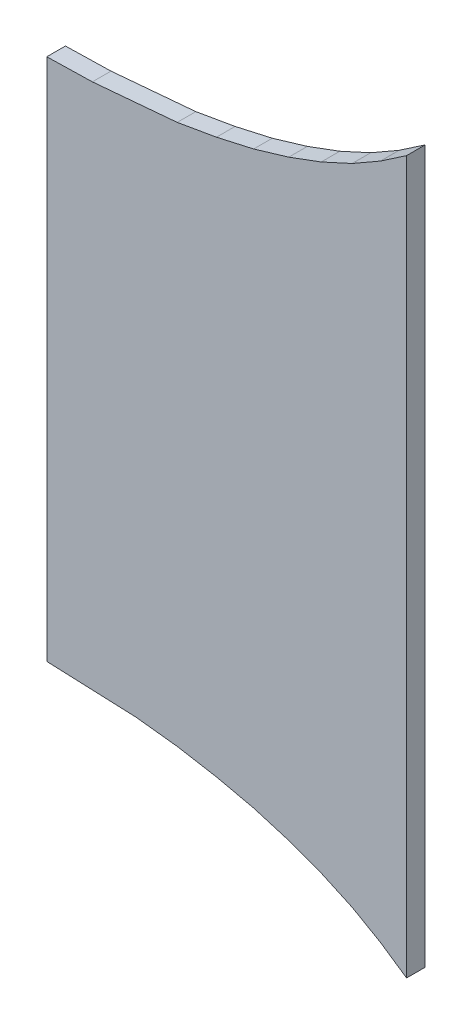
ISO-10303-21;
HEADER;
FILE_DESCRIPTION(('STEP AP214'),'2;1');
FILE_NAME('part.step','',(''),(''),'','','');
FILE_SCHEMA(('AUTOMOTIVE_DESIGN { 1 0 10303 214 1 1 1 1 }'));
ENDSEC;
DATA;
#1=APPLICATION_CONTEXT('core data for automotive mechanical design processes');
#2=APPLICATION_PROTOCOL_DEFINITION('international standard','automotive_design',2000,#1);
#3=PRODUCT_CONTEXT('',#1,'mechanical');
#4=PRODUCT('Part','Part','',(#3));
#5=PRODUCT_RELATED_PRODUCT_CATEGORY('part','',(#4));
#6=PRODUCT_DEFINITION_FORMATION('','',#4);
#7=PRODUCT_DEFINITION_CONTEXT('part definition',#1,'design');
#8=PRODUCT_DEFINITION('design','',#6,#7);
#9=PRODUCT_DEFINITION_SHAPE('','',#8);
#10=(LENGTH_UNIT() NAMED_UNIT(*) SI_UNIT(.MILLI.,.METRE.));
#11=(NAMED_UNIT(*) PLANE_ANGLE_UNIT() SI_UNIT($,.RADIAN.));
#12=(NAMED_UNIT(*) SI_UNIT($,.STERADIAN.) SOLID_ANGLE_UNIT());
#13=UNCERTAINTY_MEASURE_WITH_UNIT(LENGTH_MEASURE(1.E-05),#10,'distance_accuracy_value','');
#14=(GEOMETRIC_REPRESENTATION_CONTEXT(3) GLOBAL_UNCERTAINTY_ASSIGNED_CONTEXT((#13)) GLOBAL_UNIT_ASSIGNED_CONTEXT((#10,
#11,#12)) REPRESENTATION_CONTEXT('',''));
#15=CARTESIAN_POINT('',(0.,0.,0.));
#16=DIRECTION('',(0.,0.,1.));
#17=DIRECTION('',(1.,0.,0.));
#18=AXIS2_PLACEMENT_3D('',#15,#16,#17);
#19=CARTESIAN_POINT('',(78.7030029296875,79.6600036621094,0.));
#20=DIRECTION('',(0.0411642535086631,0.999152392897637,0.));
#21=DIRECTION('',(0.999152392897637,-0.0411642535086631,0.));
#22=AXIS2_PLACEMENT_3D('',#19,#20,#21);
#23=PLANE('',#22);
#24=DIRECTION('',(0.999152392897637,-0.0411642535086631,0.));
#25=VECTOR('',#24,1.);
#26=CARTESIAN_POINT('',(78.7030029296875,79.6600036621094,0.03556));
#27=LINE('',#26,#25);
#28=CARTESIAN_POINT('',(78.7030029296875,79.6600036621094,0.03556));
#29=VERTEX_POINT('',#28);
#30=CARTESIAN_POINT('',(78.8730010986328,79.6529998779297,0.03556));
#31=VERTEX_POINT('',#30);
#32=EDGE_CURVE('E11',#29,#31,#27,.T.);
#33=ORIENTED_EDGE('',*,*,#32,.F.);
#34=DIRECTION('',(0.,0.,1.));
#35=VECTOR('',#34,1.);
#36=CARTESIAN_POINT('',(78.7030029296875,79.6600036621094,0.));
#37=LINE('',#36,#35);
#38=CARTESIAN_POINT('',(78.7030029296875,79.6600036621094,0.));
#39=VERTEX_POINT('',#38);
#40=EDGE_CURVE('E24',#39,#29,#37,.T.);
#41=ORIENTED_EDGE('',*,*,#40,.F.);
#42=DIRECTION('',(0.999152392897637,-0.0411642535086631,0.));
#43=VECTOR('',#42,1.);
#44=CARTESIAN_POINT('',(78.7030029296875,79.6600036621094,0.));
#45=LINE('',#44,#43);
#46=CARTESIAN_POINT('',(78.8730010986328,79.6529998779297,0.));
#47=VERTEX_POINT('',#46);
#48=EDGE_CURVE('E172',#39,#47,#45,.T.);
#49=ORIENTED_EDGE('',*,*,#48,.T.);
#50=DIRECTION('',(0.,0.,1.));
#51=VECTOR('',#50,1.);
#52=CARTESIAN_POINT('',(78.8730010986328,79.6529998779297,0.));
#53=LINE('',#52,#51);
#54=EDGE_CURVE('E37',#47,#31,#53,.T.);
#55=ORIENTED_EDGE('',*,*,#54,.T.);
#56=EDGE_LOOP('',(#33,#41,#49,#55));
#57=FACE_BOUND('',#56,.T.);
#58=ADVANCED_FACE('F17',(#57),#23,.F.);
#59=CARTESIAN_POINT('',(78.8730010986328,79.6529998779297,0.));
#60=DIRECTION('',(0.113221852593987,0.993569731873504,0.));
#61=DIRECTION('',(0.993569731873504,-0.113221852593987,0.));
#62=AXIS2_PLACEMENT_3D('',#59,#60,#61);
#63=PLANE('',#62);
#64=DIRECTION('',(0.993569731873504,-0.113221852593987,0.));
#65=VECTOR('',#64,1.);
#66=CARTESIAN_POINT('',(78.8730010986328,79.6529998779297,0.03556));
#67=LINE('',#66,#65);
#68=CARTESIAN_POINT('',(78.9520034790039,79.6439971923828,0.03556));
#69=VERTEX_POINT('',#68);
#70=EDGE_CURVE('E308',#31,#69,#67,.T.);
#71=ORIENTED_EDGE('',*,*,#70,.F.);
#72=ORIENTED_EDGE('',*,*,#54,.F.);
#73=DIRECTION('',(0.993569731873504,-0.113221852593987,0.));
#74=VECTOR('',#73,1.);
#75=CARTESIAN_POINT('',(78.8730010986328,79.6529998779297,0.));
#76=LINE('',#75,#74);
#77=CARTESIAN_POINT('',(78.9520034790039,79.6439971923828,0.));
#78=VERTEX_POINT('',#77);
#79=EDGE_CURVE('E305',#47,#78,#76,.T.);
#80=ORIENTED_EDGE('',*,*,#79,.T.);
#81=DIRECTION('',(0.,0.,1.));
#82=VECTOR('',#81,1.);
#83=CARTESIAN_POINT('',(78.9520034790039,79.6439971923828,0.));
#84=LINE('',#83,#82);
#85=EDGE_CURVE('E303',#78,#69,#84,.T.);
#86=ORIENTED_EDGE('',*,*,#85,.T.);
#87=EDGE_LOOP('',(#71,#72,#80,#86));
#88=FACE_BOUND('',#87,.T.);
#89=ADVANCED_FACE('F316',(#88),#63,.F.);
#90=CARTESIAN_POINT('',(78.9520034790039,79.6439971923828,0.));
#91=DIRECTION('',(0.170799698309455,0.985305771350904,0.));
#92=DIRECTION('',(0.985305771350904,-0.170799698309455,0.));
#93=AXIS2_PLACEMENT_3D('',#90,#91,#92);
#94=PLANE('',#93);
#95=DIRECTION('',(0.985305771350904,-0.170799698309455,0.));
#96=VECTOR('',#95,1.);
#97=CARTESIAN_POINT('',(78.9520034790039,79.6439971923828,0.03556));
#98=LINE('',#97,#96);
#99=CARTESIAN_POINT('',(79.0270004272461,79.6309967041016,0.03556));
#100=VERTEX_POINT('',#99);
#101=EDGE_CURVE('E300',#69,#100,#98,.T.);
#102=ORIENTED_EDGE('',*,*,#101,.F.);
#103=ORIENTED_EDGE('',*,*,#85,.F.);
#104=DIRECTION('',(0.985305771350904,-0.170799698309455,0.));
#105=VECTOR('',#104,1.);
#106=CARTESIAN_POINT('',(78.9520034790039,79.6439971923828,0.));
#107=LINE('',#106,#105);
#108=CARTESIAN_POINT('',(79.0270004272461,79.6309967041016,0.));
#109=VERTEX_POINT('',#108);
#110=EDGE_CURVE('E297',#78,#109,#107,.T.);
#111=ORIENTED_EDGE('',*,*,#110,.T.);
#112=DIRECTION('',(0.,0.,1.));
#113=VECTOR('',#112,1.);
#114=CARTESIAN_POINT('',(79.0270004272461,79.6309967041016,0.));
#115=LINE('',#114,#113);
#116=EDGE_CURVE('E295',#109,#100,#115,.T.);
#117=ORIENTED_EDGE('',*,*,#116,.T.);
#118=EDGE_LOOP('',(#102,#103,#111,#117));
#119=FACE_BOUND('',#118,.T.);
#120=ADVANCED_FACE('F322',(#119),#94,.F.);
#121=CARTESIAN_POINT('',(79.0270004272461,79.6309967041016,0.));
#122=DIRECTION('',(0.219826483748733,0.975538987966482,0.));
#123=DIRECTION('',(0.975538987966482,-0.219826483748733,0.));
#124=AXIS2_PLACEMENT_3D('',#121,#122,#123);
#125=PLANE('',#124);
#126=DIRECTION('',(0.975538987966482,-0.219826483748733,0.));
#127=VECTOR('',#126,1.);
#128=CARTESIAN_POINT('',(79.0270004272461,79.6309967041016,0.03556));
#129=LINE('',#128,#127);
#130=CARTESIAN_POINT('',(79.0979995727539,79.6149978637695,0.03556));
#131=VERTEX_POINT('',#130);
#132=EDGE_CURVE('E292',#100,#131,#129,.T.);
#133=ORIENTED_EDGE('',*,*,#132,.F.);
#134=ORIENTED_EDGE('',*,*,#116,.F.);
#135=DIRECTION('',(0.975538987966482,-0.219826483748733,0.));
#136=VECTOR('',#135,1.);
#137=CARTESIAN_POINT('',(79.0270004272461,79.6309967041016,0.));
#138=LINE('',#137,#136);
#139=CARTESIAN_POINT('',(79.0979995727539,79.6149978637695,0.));
#140=VERTEX_POINT('',#139);
#141=EDGE_CURVE('E289',#109,#140,#138,.T.);
#142=ORIENTED_EDGE('',*,*,#141,.T.);
#143=DIRECTION('',(0.,0.,1.));
#144=VECTOR('',#143,1.);
#145=CARTESIAN_POINT('',(79.0979995727539,79.6149978637695,0.));
#146=LINE('',#145,#144);
#147=EDGE_CURVE('E287',#140,#131,#146,.T.);
#148=ORIENTED_EDGE('',*,*,#147,.T.);
#149=EDGE_LOOP('',(#133,#134,#142,#148));
#150=FACE_BOUND('',#149,.T.);
#151=ADVANCED_FACE('F324',(#150),#125,.F.);
#152=CARTESIAN_POINT('',(79.0979995727539,79.6149978637695,0.));
#153=DIRECTION('',(0.285986180602538,0.958233742102819,0.));
#154=DIRECTION('',(0.958233742102819,-0.285986180602538,0.));
#155=AXIS2_PLACEMENT_3D('',#152,#153,#154);
#156=PLANE('',#155);
#157=DIRECTION('',(0.958233742102819,-0.285986180602538,0.));
#158=VECTOR('',#157,1.);
#159=CARTESIAN_POINT('',(79.0979995727539,79.6149978637695,0.03556));
#160=LINE('',#159,#158);
#161=CARTESIAN_POINT('',(79.1650009155273,79.5950012207031,0.03556));
#162=VERTEX_POINT('',#161);
#163=EDGE_CURVE('E284',#131,#162,#160,.T.);
#164=ORIENTED_EDGE('',*,*,#163,.F.);
#165=ORIENTED_EDGE('',*,*,#147,.F.);
#166=DIRECTION('',(0.958233742102819,-0.285986180602538,0.));
#167=VECTOR('',#166,1.);
#168=CARTESIAN_POINT('',(79.0979995727539,79.6149978637695,0.));
#169=LINE('',#168,#167);
#170=CARTESIAN_POINT('',(79.1650009155273,79.5950012207031,0.));
#171=VERTEX_POINT('',#170);
#172=EDGE_CURVE('E281',#140,#171,#169,.T.);
#173=ORIENTED_EDGE('',*,*,#172,.T.);
#174=DIRECTION('',(0.,0.,1.));
#175=VECTOR('',#174,1.);
#176=CARTESIAN_POINT('',(79.1650009155273,79.5950012207031,0.));
#177=LINE('',#176,#175);
#178=EDGE_CURVE('E279',#171,#162,#177,.T.);
#179=ORIENTED_EDGE('',*,*,#178,.T.);
#180=EDGE_LOOP('',(#164,#165,#173,#179));
#181=FACE_BOUND('',#180,.T.);
#182=ADVANCED_FACE('F329',(#181),#156,.F.);
#183=CARTESIAN_POINT('',(79.1650009155273,79.5950012207031,0.));
#184=DIRECTION('',(0.347859167792918,0.93754679850257,0.));
#185=DIRECTION('',(0.93754679850257,-0.347859167792918,0.));
#186=AXIS2_PLACEMENT_3D('',#183,#184,#185);
#187=PLANE('',#186);
#188=DIRECTION('',(0.93754679850257,-0.347859167792918,0.));
#189=VECTOR('',#188,1.);
#190=CARTESIAN_POINT('',(79.1650009155273,79.5950012207031,0.03556));
#191=LINE('',#190,#189);
#192=CARTESIAN_POINT('',(79.2269973754883,79.5719985961914,0.03556));
#193=VERTEX_POINT('',#192);
#194=EDGE_CURVE('E276',#162,#193,#191,.T.);
#195=ORIENTED_EDGE('',*,*,#194,.F.);
#196=ORIENTED_EDGE('',*,*,#178,.F.);
#197=DIRECTION('',(0.93754679850257,-0.347859167792918,0.));
#198=VECTOR('',#197,1.);
#199=CARTESIAN_POINT('',(79.1650009155273,79.5950012207031,0.));
#200=LINE('',#199,#198);
#201=CARTESIAN_POINT('',(79.2269973754883,79.5719985961914,0.));
#202=VERTEX_POINT('',#201);
#203=EDGE_CURVE('E273',#171,#202,#200,.T.);
#204=ORIENTED_EDGE('',*,*,#203,.T.);
#205=DIRECTION('',(0.,0.,1.));
#206=VECTOR('',#205,1.);
#207=CARTESIAN_POINT('',(79.2269973754883,79.5719985961914,0.));
#208=LINE('',#207,#206);
#209=EDGE_CURVE('E271',#202,#193,#208,.T.);
#210=ORIENTED_EDGE('',*,*,#209,.T.);
#211=EDGE_LOOP('',(#195,#196,#204,#210));
#212=FACE_BOUND('',#211,.T.);
#213=ADVANCED_FACE('F332',(#212),#187,.F.);
#214=CARTESIAN_POINT('',(79.2269973754883,79.5719985961914,0.));
#215=DIRECTION('',(0.416095942360234,0.909320717212221,0.));
#216=DIRECTION('',(0.909320717212221,-0.416095942360234,0.));
#217=AXIS2_PLACEMENT_3D('',#214,#215,#216);
#218=PLANE('',#217);
#219=DIRECTION('',(0.909320717212221,-0.416095942360234,0.));
#220=VECTOR('',#219,1.);
#221=CARTESIAN_POINT('',(79.2269973754883,79.5719985961914,0.03556));
#222=LINE('',#221,#220);
#223=CARTESIAN_POINT('',(79.286003112793,79.5449981689453,0.03556));
#224=VERTEX_POINT('',#223);
#225=EDGE_CURVE('E268',#193,#224,#222,.T.);
#226=ORIENTED_EDGE('',*,*,#225,.F.);
#227=ORIENTED_EDGE('',*,*,#209,.F.);
#228=DIRECTION('',(0.909320717212221,-0.416095942360234,0.));
#229=VECTOR('',#228,1.);
#230=CARTESIAN_POINT('',(79.2269973754883,79.5719985961914,0.));
#231=LINE('',#230,#229);
#232=CARTESIAN_POINT('',(79.286003112793,79.5449981689453,0.));
#233=VERTEX_POINT('',#232);
#234=EDGE_CURVE('E265',#202,#233,#231,.T.);
#235=ORIENTED_EDGE('',*,*,#234,.T.);
#236=DIRECTION('',(0.,0.,1.));
#237=VECTOR('',#236,1.);
#238=CARTESIAN_POINT('',(79.286003112793,79.5449981689453,0.));
#239=LINE('',#238,#237);
#240=EDGE_CURVE('E263',#233,#224,#239,.T.);
#241=ORIENTED_EDGE('',*,*,#240,.T.);
#242=EDGE_LOOP('',(#226,#227,#235,#241));
#243=FACE_BOUND('',#242,.T.);
#244=ADVANCED_FACE('F337',(#243),#218,.F.);
#245=CARTESIAN_POINT('',(79.286003112793,79.5449981689453,0.));
#246=DIRECTION('',(0.497893120609195,0.867238398855838,0.));
#247=DIRECTION('',(0.867238398855838,-0.497893120609195,0.));
#248=AXIS2_PLACEMENT_3D('',#245,#246,#247);
#249=PLANE('',#248);
#250=DIRECTION('',(0.867238398855838,-0.497893120609195,0.));
#251=VECTOR('',#250,1.);
#252=CARTESIAN_POINT('',(79.286003112793,79.5449981689453,0.03556));
#253=LINE('',#252,#251);
#254=CARTESIAN_POINT('',(79.3399963378906,79.5139999389648,0.03556));
#255=VERTEX_POINT('',#254);
#256=EDGE_CURVE('E260',#224,#255,#253,.T.);
#257=ORIENTED_EDGE('',*,*,#256,.F.);
#258=ORIENTED_EDGE('',*,*,#240,.F.);
#259=DIRECTION('',(0.867238398855838,-0.497893120609195,0.));
#260=VECTOR('',#259,1.);
#261=CARTESIAN_POINT('',(79.286003112793,79.5449981689453,0.));
#262=LINE('',#261,#260);
#263=CARTESIAN_POINT('',(79.3399963378906,79.5139999389648,0.));
#264=VERTEX_POINT('',#263);
#265=EDGE_CURVE('E257',#233,#264,#262,.T.);
#266=ORIENTED_EDGE('',*,*,#265,.T.);
#267=DIRECTION('',(0.,0.,1.));
#268=VECTOR('',#267,1.);
#269=CARTESIAN_POINT('',(79.3399963378906,79.5139999389648,0.));
#270=LINE('',#269,#268);
#271=EDGE_CURVE('E255',#264,#255,#270,.T.);
#272=ORIENTED_EDGE('',*,*,#271,.T.);
#273=EDGE_LOOP('',(#257,#258,#266,#272));
#274=FACE_BOUND('',#273,.T.);
#275=ADVANCED_FACE('F340',(#274),#249,.F.);
#276=CARTESIAN_POINT('',(79.3399963378906,79.5139999389648,0.));
#277=DIRECTION('',(0.562247897313219,0.826968743041032,0.));
#278=DIRECTION('',(0.826968743041032,-0.562247897313219,0.));
#279=AXIS2_PLACEMENT_3D('',#276,#277,#278);
#280=PLANE('',#279);
#281=DIRECTION('',(0.826968743041032,-0.562247897313219,0.));
#282=VECTOR('',#281,1.);
#283=CARTESIAN_POINT('',(79.3399963378906,79.5139999389648,0.03556));
#284=LINE('',#283,#282);
#285=CARTESIAN_POINT('',(79.3899993896484,79.4800033569336,0.03556));
#286=VERTEX_POINT('',#285);
#287=EDGE_CURVE('E252',#255,#286,#284,.T.);
#288=ORIENTED_EDGE('',*,*,#287,.F.);
#289=ORIENTED_EDGE('',*,*,#271,.F.);
#290=DIRECTION('',(0.826968743041032,-0.562247897313219,0.));
#291=VECTOR('',#290,1.);
#292=CARTESIAN_POINT('',(79.3399963378906,79.5139999389648,0.));
#293=LINE('',#292,#291);
#294=CARTESIAN_POINT('',(79.3899993896484,79.4800033569336,0.));
#295=VERTEX_POINT('',#294);
#296=EDGE_CURVE('E249',#264,#295,#293,.T.);
#297=ORIENTED_EDGE('',*,*,#296,.T.);
#298=DIRECTION('',(0.,0.,1.));
#299=VECTOR('',#298,1.);
#300=CARTESIAN_POINT('',(79.3899993896484,79.4800033569336,0.));
#301=LINE('',#300,#299);
#302=EDGE_CURVE('E247',#295,#286,#301,.T.);
#303=ORIENTED_EDGE('',*,*,#302,.T.);
#304=EDGE_LOOP('',(#288,#289,#297,#303));
#305=FACE_BOUND('',#304,.T.);
#306=ADVANCED_FACE('F345',(#305),#280,.F.);
#307=CARTESIAN_POINT('',(79.3899993896484,79.4800033569336,0.));
#308=DIRECTION('',(-1.,0.,0.));
#309=DIRECTION('',(0.,1.,0.));
#310=AXIS2_PLACEMENT_3D('',#307,#308,#309);
#311=PLANE('',#310);
#312=DIRECTION('',(0.,1.,0.));
#313=VECTOR('',#312,1.);
#314=CARTESIAN_POINT('',(79.3899993896484,79.4800033569336,0.03556));
#315=LINE('',#314,#313);
#316=CARTESIAN_POINT('',(79.3899993896484,80.8399963378906,0.03556));
#317=VERTEX_POINT('',#316);
#318=EDGE_CURVE('E244',#286,#317,#315,.T.);
#319=ORIENTED_EDGE('',*,*,#318,.F.);
#320=ORIENTED_EDGE('',*,*,#302,.F.);
#321=DIRECTION('',(0.,1.,0.));
#322=VECTOR('',#321,1.);
#323=CARTESIAN_POINT('',(79.3899993896484,79.4800033569336,0.));
#324=LINE('',#323,#322);
#325=CARTESIAN_POINT('',(79.3899993896484,80.8399963378906,0.));
#326=VERTEX_POINT('',#325);
#327=EDGE_CURVE('E241',#295,#326,#324,.T.);
#328=ORIENTED_EDGE('',*,*,#327,.T.);
#329=DIRECTION('',(0.,0.,1.));
#330=VECTOR('',#329,1.);
#331=CARTESIAN_POINT('',(79.3899993896484,80.8399963378906,0.));
#332=LINE('',#331,#330);
#333=EDGE_CURVE('E239',#326,#317,#332,.T.);
#334=ORIENTED_EDGE('',*,*,#333,.T.);
#335=EDGE_LOOP('',(#319,#320,#328,#334));
#336=FACE_BOUND('',#335,.T.);
#337=ADVANCED_FACE('F348',(#336),#311,.F.);
#338=CARTESIAN_POINT('',(79.3899993896484,80.8399963378906,0.));
#339=DIRECTION('',(0.562247897313219,-0.826968743041032,0.));
#340=DIRECTION('',(-0.826968743041032,-0.562247897313219,0.));
#341=AXIS2_PLACEMENT_3D('',#338,#339,#340);
#342=PLANE('',#341);
#343=DIRECTION('',(-0.826968743041032,-0.562247897313219,0.));
#344=VECTOR('',#343,1.);
#345=CARTESIAN_POINT('',(79.3899993896484,80.8399963378906,0.03556));
#346=LINE('',#345,#344);
#347=CARTESIAN_POINT('',(79.3399963378906,80.8059997558594,0.03556));
#348=VERTEX_POINT('',#347);
#349=EDGE_CURVE('E236',#317,#348,#346,.T.);
#350=ORIENTED_EDGE('',*,*,#349,.F.);
#351=ORIENTED_EDGE('',*,*,#333,.F.);
#352=DIRECTION('',(-0.826968743041032,-0.562247897313219,0.));
#353=VECTOR('',#352,1.);
#354=CARTESIAN_POINT('',(79.3899993896484,80.8399963378906,0.));
#355=LINE('',#354,#353);
#356=CARTESIAN_POINT('',(79.3399963378906,80.8059997558594,0.));
#357=VERTEX_POINT('',#356);
#358=EDGE_CURVE('E233',#326,#357,#355,.T.);
#359=ORIENTED_EDGE('',*,*,#358,.T.);
#360=DIRECTION('',(0.,0.,1.));
#361=VECTOR('',#360,1.);
#362=CARTESIAN_POINT('',(79.3399963378906,80.8059997558594,0.));
#363=LINE('',#362,#361);
#364=EDGE_CURVE('E231',#357,#348,#363,.T.);
#365=ORIENTED_EDGE('',*,*,#364,.T.);
#366=EDGE_LOOP('',(#350,#351,#359,#365));
#367=FACE_BOUND('',#366,.T.);
#368=ADVANCED_FACE('F353',(#367),#342,.F.);
#369=CARTESIAN_POINT('',(79.3399963378906,80.8059997558594,0.));
#370=DIRECTION('',(0.497893120609195,-0.867238398855838,0.));
#371=DIRECTION('',(-0.867238398855838,-0.497893120609195,0.));
#372=AXIS2_PLACEMENT_3D('',#369,#370,#371);
#373=PLANE('',#372);
#374=DIRECTION('',(-0.867238398855838,-0.497893120609195,0.));
#375=VECTOR('',#374,1.);
#376=CARTESIAN_POINT('',(79.3399963378906,80.8059997558594,0.03556));
#377=LINE('',#376,#375);
#378=CARTESIAN_POINT('',(79.286003112793,80.7750015258789,0.03556));
#379=VERTEX_POINT('',#378);
#380=EDGE_CURVE('E228',#348,#379,#377,.T.);
#381=ORIENTED_EDGE('',*,*,#380,.F.);
#382=ORIENTED_EDGE('',*,*,#364,.F.);
#383=DIRECTION('',(-0.867238398855838,-0.497893120609195,0.));
#384=VECTOR('',#383,1.);
#385=CARTESIAN_POINT('',(79.3399963378906,80.8059997558594,0.));
#386=LINE('',#385,#384);
#387=CARTESIAN_POINT('',(79.286003112793,80.7750015258789,0.));
#388=VERTEX_POINT('',#387);
#389=EDGE_CURVE('E225',#357,#388,#386,.T.);
#390=ORIENTED_EDGE('',*,*,#389,.T.);
#391=DIRECTION('',(0.,0.,1.));
#392=VECTOR('',#391,1.);
#393=CARTESIAN_POINT('',(79.286003112793,80.7750015258789,0.));
#394=LINE('',#393,#392);
#395=EDGE_CURVE('E223',#388,#379,#394,.T.);
#396=ORIENTED_EDGE('',*,*,#395,.T.);
#397=EDGE_LOOP('',(#381,#382,#390,#396));
#398=FACE_BOUND('',#397,.T.);
#399=ADVANCED_FACE('F356',(#398),#373,.F.);
#400=CARTESIAN_POINT('',(79.286003112793,80.7750015258789,0.));
#401=DIRECTION('',(0.416095942360234,-0.909320717212221,0.));
#402=DIRECTION('',(-0.909320717212221,-0.416095942360234,0.));
#403=AXIS2_PLACEMENT_3D('',#400,#401,#402);
#404=PLANE('',#403);
#405=DIRECTION('',(-0.909320717212221,-0.416095942360234,0.));
#406=VECTOR('',#405,1.);
#407=CARTESIAN_POINT('',(79.286003112793,80.7750015258789,0.03556));
#408=LINE('',#407,#406);
#409=CARTESIAN_POINT('',(79.2269973754883,80.7480010986328,0.03556));
#410=VERTEX_POINT('',#409);
#411=EDGE_CURVE('E220',#379,#410,#408,.T.);
#412=ORIENTED_EDGE('',*,*,#411,.F.);
#413=ORIENTED_EDGE('',*,*,#395,.F.);
#414=DIRECTION('',(-0.909320717212221,-0.416095942360234,0.));
#415=VECTOR('',#414,1.);
#416=CARTESIAN_POINT('',(79.286003112793,80.7750015258789,0.));
#417=LINE('',#416,#415);
#418=CARTESIAN_POINT('',(79.2269973754883,80.7480010986328,0.));
#419=VERTEX_POINT('',#418);
#420=EDGE_CURVE('E217',#388,#419,#417,.T.);
#421=ORIENTED_EDGE('',*,*,#420,.T.);
#422=DIRECTION('',(0.,0.,1.));
#423=VECTOR('',#422,1.);
#424=CARTESIAN_POINT('',(79.2269973754883,80.7480010986328,0.));
#425=LINE('',#424,#423);
#426=EDGE_CURVE('E215',#419,#410,#425,.T.);
#427=ORIENTED_EDGE('',*,*,#426,.T.);
#428=EDGE_LOOP('',(#412,#413,#421,#427));
#429=FACE_BOUND('',#428,.T.);
#430=ADVANCED_FACE('F361',(#429),#404,.F.);
#431=CARTESIAN_POINT('',(79.2269973754883,80.7480010986328,0.));
#432=DIRECTION('',(0.347859167792918,-0.93754679850257,0.));
#433=DIRECTION('',(-0.93754679850257,-0.347859167792918,0.));
#434=AXIS2_PLACEMENT_3D('',#431,#432,#433);
#435=PLANE('',#434);
#436=DIRECTION('',(-0.93754679850257,-0.347859167792918,0.));
#437=VECTOR('',#436,1.);
#438=CARTESIAN_POINT('',(79.2269973754883,80.7480010986328,0.03556));
#439=LINE('',#438,#437);
#440=CARTESIAN_POINT('',(79.1650009155273,80.7249984741211,0.03556));
#441=VERTEX_POINT('',#440);
#442=EDGE_CURVE('E212',#410,#441,#439,.T.);
#443=ORIENTED_EDGE('',*,*,#442,.F.);
#444=ORIENTED_EDGE('',*,*,#426,.F.);
#445=DIRECTION('',(-0.93754679850257,-0.347859167792918,0.));
#446=VECTOR('',#445,1.);
#447=CARTESIAN_POINT('',(79.2269973754883,80.7480010986328,0.));
#448=LINE('',#447,#446);
#449=CARTESIAN_POINT('',(79.1650009155273,80.7249984741211,0.));
#450=VERTEX_POINT('',#449);
#451=EDGE_CURVE('E209',#419,#450,#448,.T.);
#452=ORIENTED_EDGE('',*,*,#451,.T.);
#453=DIRECTION('',(0.,0.,1.));
#454=VECTOR('',#453,1.);
#455=CARTESIAN_POINT('',(79.1650009155273,80.7249984741211,0.));
#456=LINE('',#455,#454);
#457=EDGE_CURVE('E207',#450,#441,#456,.T.);
#458=ORIENTED_EDGE('',*,*,#457,.T.);
#459=EDGE_LOOP('',(#443,#444,#452,#458));
#460=FACE_BOUND('',#459,.T.);
#461=ADVANCED_FACE('F364',(#460),#435,.F.);
#462=CARTESIAN_POINT('',(79.1650009155273,80.7249984741211,0.));
#463=DIRECTION('',(0.285986180602538,-0.958233742102819,0.));
#464=DIRECTION('',(-0.958233742102819,-0.285986180602538,0.));
#465=AXIS2_PLACEMENT_3D('',#462,#463,#464);
#466=PLANE('',#465);
#467=DIRECTION('',(-0.958233742102819,-0.285986180602538,0.));
#468=VECTOR('',#467,1.);
#469=CARTESIAN_POINT('',(79.1650009155273,80.7249984741211,0.03556));
#470=LINE('',#469,#468);
#471=CARTESIAN_POINT('',(79.0979995727539,80.7050018310547,0.03556));
#472=VERTEX_POINT('',#471);
#473=EDGE_CURVE('E204',#441,#472,#470,.T.);
#474=ORIENTED_EDGE('',*,*,#473,.F.);
#475=ORIENTED_EDGE('',*,*,#457,.F.);
#476=DIRECTION('',(-0.958233742102819,-0.285986180602538,0.));
#477=VECTOR('',#476,1.);
#478=CARTESIAN_POINT('',(79.1650009155273,80.7249984741211,0.));
#479=LINE('',#478,#477);
#480=CARTESIAN_POINT('',(79.0979995727539,80.7050018310547,0.));
#481=VERTEX_POINT('',#480);
#482=EDGE_CURVE('E201',#450,#481,#479,.T.);
#483=ORIENTED_EDGE('',*,*,#482,.T.);
#484=DIRECTION('',(0.,0.,1.));
#485=VECTOR('',#484,1.);
#486=CARTESIAN_POINT('',(79.0979995727539,80.7050018310547,0.));
#487=LINE('',#486,#485);
#488=EDGE_CURVE('E199',#481,#472,#487,.T.);
#489=ORIENTED_EDGE('',*,*,#488,.T.);
#490=EDGE_LOOP('',(#474,#475,#483,#489));
#491=FACE_BOUND('',#490,.T.);
#492=ADVANCED_FACE('F369',(#491),#466,.F.);
#493=CARTESIAN_POINT('',(79.0979995727539,80.7050018310547,0.));
#494=DIRECTION('',(0.219826483748733,-0.975538987966482,0.));
#495=DIRECTION('',(-0.975538987966482,-0.219826483748733,0.));
#496=AXIS2_PLACEMENT_3D('',#493,#494,#495);
#497=PLANE('',#496);
#498=DIRECTION('',(-0.975538987966482,-0.219826483748733,0.));
#499=VECTOR('',#498,1.);
#500=CARTESIAN_POINT('',(79.0979995727539,80.7050018310547,0.03556));
#501=LINE('',#500,#499);
#502=CARTESIAN_POINT('',(79.0270004272461,80.6890029907227,0.03556));
#503=VERTEX_POINT('',#502);
#504=EDGE_CURVE('E196',#472,#503,#501,.T.);
#505=ORIENTED_EDGE('',*,*,#504,.F.);
#506=ORIENTED_EDGE('',*,*,#488,.F.);
#507=DIRECTION('',(-0.975538987966482,-0.219826483748733,0.));
#508=VECTOR('',#507,1.);
#509=CARTESIAN_POINT('',(79.0979995727539,80.7050018310547,0.));
#510=LINE('',#509,#508);
#511=CARTESIAN_POINT('',(79.0270004272461,80.6890029907227,0.));
#512=VERTEX_POINT('',#511);
#513=EDGE_CURVE('E193',#481,#512,#510,.T.);
#514=ORIENTED_EDGE('',*,*,#513,.T.);
#515=DIRECTION('',(0.,0.,1.));
#516=VECTOR('',#515,1.);
#517=CARTESIAN_POINT('',(79.0270004272461,80.6890029907227,0.));
#518=LINE('',#517,#516);
#519=EDGE_CURVE('E191',#512,#503,#518,.T.);
#520=ORIENTED_EDGE('',*,*,#519,.T.);
#521=EDGE_LOOP('',(#505,#506,#514,#520));
#522=FACE_BOUND('',#521,.T.);
#523=ADVANCED_FACE('F372',(#522),#497,.F.);
#524=CARTESIAN_POINT('',(79.0270004272461,80.6890029907227,0.));
#525=DIRECTION('',(0.170799698309455,-0.985305771350904,0.));
#526=DIRECTION('',(-0.985305771350904,-0.170799698309455,0.));
#527=AXIS2_PLACEMENT_3D('',#524,#525,#526);
#528=PLANE('',#527);
#529=DIRECTION('',(-0.985305771350904,-0.170799698309455,0.));
#530=VECTOR('',#529,1.);
#531=CARTESIAN_POINT('',(79.0270004272461,80.6890029907227,0.03556));
#532=LINE('',#531,#530);
#533=CARTESIAN_POINT('',(78.9520034790039,80.6760025024414,0.03556));
#534=VERTEX_POINT('',#533);
#535=EDGE_CURVE('E188',#503,#534,#532,.T.);
#536=ORIENTED_EDGE('',*,*,#535,.F.);
#537=ORIENTED_EDGE('',*,*,#519,.F.);
#538=DIRECTION('',(-0.985305771350904,-0.170799698309455,0.));
#539=VECTOR('',#538,1.);
#540=CARTESIAN_POINT('',(79.0270004272461,80.6890029907227,0.));
#541=LINE('',#540,#539);
#542=CARTESIAN_POINT('',(78.9520034790039,80.6760025024414,0.));
#543=VERTEX_POINT('',#542);
#544=EDGE_CURVE('E185',#512,#543,#541,.T.);
#545=ORIENTED_EDGE('',*,*,#544,.T.);
#546=DIRECTION('',(0.,0.,1.));
#547=VECTOR('',#546,1.);
#548=CARTESIAN_POINT('',(78.9520034790039,80.6760025024414,0.));
#549=LINE('',#548,#547);
#550=EDGE_CURVE('E183',#543,#534,#549,.T.);
#551=ORIENTED_EDGE('',*,*,#550,.T.);
#552=EDGE_LOOP('',(#536,#537,#545,#551));
#553=FACE_BOUND('',#552,.T.);
#554=ADVANCED_FACE('F377',(#553),#528,.F.);
#555=CARTESIAN_POINT('',(78.9520034790039,80.6760025024414,0.));
#556=DIRECTION('',(0.0860971171043161,-0.996286749097029,0.));
#557=DIRECTION('',(-0.996286749097029,-0.0860971171043161,0.));
#558=AXIS2_PLACEMENT_3D('',#555,#556,#557);
#559=PLANE('',#558);
#560=DIRECTION('',(-0.996286749097029,-0.0860971171043161,0.));
#561=VECTOR('',#560,1.);
#562=CARTESIAN_POINT('',(78.9520034790039,80.6760025024414,0.03556));
#563=LINE('',#562,#561);
#564=CARTESIAN_POINT('',(78.7900009155273,80.6620025634766,0.03556));
#565=VERTEX_POINT('',#564);
#566=EDGE_CURVE('E180',#534,#565,#563,.T.);
#567=ORIENTED_EDGE('',*,*,#566,.F.);
#568=ORIENTED_EDGE('',*,*,#550,.F.);
#569=DIRECTION('',(-0.996286749097029,-0.0860971171043161,0.));
#570=VECTOR('',#569,1.);
#571=CARTESIAN_POINT('',(78.9520034790039,80.6760025024414,0.));
#572=LINE('',#571,#570);
#573=CARTESIAN_POINT('',(78.7900009155273,80.6620025634766,0.));
#574=VERTEX_POINT('',#573);
#575=EDGE_CURVE('E178',#543,#574,#572,.T.);
#576=ORIENTED_EDGE('',*,*,#575,.T.);
#577=DIRECTION('',(0.,0.,1.));
#578=VECTOR('',#577,1.);
#579=CARTESIAN_POINT('',(78.7900009155273,80.6620025634766,0.));
#580=LINE('',#579,#578);
#581=EDGE_CURVE('E163',#574,#565,#580,.T.);
#582=ORIENTED_EDGE('',*,*,#581,.T.);
#583=EDGE_LOOP('',(#567,#568,#576,#582));
#584=FACE_BOUND('',#583,.T.);
#585=ADVANCED_FACE('F379',(#584),#559,.F.);
#586=CARTESIAN_POINT('',(78.7900009155273,80.6620025634766,0.));
#587=DIRECTION('',(0.0229703473166585,-0.999736146762811,0.));
#588=DIRECTION('',(-0.999736146762811,-0.0229703473166585,0.));
#589=AXIS2_PLACEMENT_3D('',#586,#587,#588);
#590=PLANE('',#589);
#591=DIRECTION('',(-0.999736146762811,-0.0229703473166585,0.));
#592=VECTOR('',#591,1.);
#593=CARTESIAN_POINT('',(78.7900009155273,80.6620025634766,0.03556));
#594=LINE('',#593,#592);
#595=CARTESIAN_POINT('',(78.7030029296875,80.6600036621094,0.03556));
#596=VERTEX_POINT('',#595);
#597=EDGE_CURVE('E167',#565,#596,#594,.T.);
#598=ORIENTED_EDGE('',*,*,#597,.F.);
#599=ORIENTED_EDGE('',*,*,#581,.F.);
#600=DIRECTION('',(-0.999736146762811,-0.0229703473166585,0.));
#601=VECTOR('',#600,1.);
#602=CARTESIAN_POINT('',(78.7900009155273,80.6620025634766,0.));
#603=LINE('',#602,#601);
#604=CARTESIAN_POINT('',(78.7030029296875,80.6600036621094,0.));
#605=VERTEX_POINT('',#604);
#606=EDGE_CURVE('E159',#574,#605,#603,.T.);
#607=ORIENTED_EDGE('',*,*,#606,.T.);
#608=DIRECTION('',(0.,0.,1.));
#609=VECTOR('',#608,1.);
#610=CARTESIAN_POINT('',(78.7030029296875,80.6600036621094,0.));
#611=LINE('',#610,#609);
#612=EDGE_CURVE('E149',#605,#596,#611,.T.);
#613=ORIENTED_EDGE('',*,*,#612,.T.);
#614=EDGE_LOOP('',(#598,#599,#607,#613));
#615=FACE_BOUND('',#614,.T.);
#616=ADVANCED_FACE('F162',(#615),#590,.F.);
#617=CARTESIAN_POINT('',(78.7030029296875,80.6600036621094,0.));
#618=DIRECTION('',(1.,0.,0.));
#619=DIRECTION('',(0.,-1.,0.));
#620=AXIS2_PLACEMENT_3D('',#617,#618,#619);
#621=PLANE('',#620);
#622=DIRECTION('',(0.,-1.,0.));
#623=VECTOR('',#622,1.);
#624=CARTESIAN_POINT('',(78.7030029296875,80.6600036621094,0.03556));
#625=LINE('',#624,#623);
#626=EDGE_CURVE('E155',#596,#29,#625,.T.);
#627=ORIENTED_EDGE('',*,*,#626,.F.);
#628=ORIENTED_EDGE('',*,*,#612,.F.);
#629=DIRECTION('',(0.,-1.,0.));
#630=VECTOR('',#629,1.);
#631=CARTESIAN_POINT('',(78.7030029296875,80.6600036621094,0.));
#632=LINE('',#631,#630);
#633=EDGE_CURVE('E153',#605,#39,#632,.T.);
#634=ORIENTED_EDGE('',*,*,#633,.T.);
#635=ORIENTED_EDGE('',*,*,#40,.T.);
#636=EDGE_LOOP('',(#627,#628,#634,#635));
#637=FACE_BOUND('',#636,.T.);
#638=ADVANCED_FACE('F151',(#637),#621,.F.);
#639=CARTESIAN_POINT('',(78.7030029296875,79.6600036621094,0.));
#640=DIRECTION('',(0.,0.,1.));
#641=DIRECTION('',(1.,0.,0.));
#642=AXIS2_PLACEMENT_3D('',#639,#640,#641);
#643=PLANE('',#642);
#644=ORIENTED_EDGE('',*,*,#633,.F.);
#645=ORIENTED_EDGE('',*,*,#606,.F.);
#646=ORIENTED_EDGE('',*,*,#575,.F.);
#647=ORIENTED_EDGE('',*,*,#544,.F.);
#648=ORIENTED_EDGE('',*,*,#513,.F.);
#649=ORIENTED_EDGE('',*,*,#482,.F.);
#650=ORIENTED_EDGE('',*,*,#451,.F.);
#651=ORIENTED_EDGE('',*,*,#420,.F.);
#652=ORIENTED_EDGE('',*,*,#389,.F.);
#653=ORIENTED_EDGE('',*,*,#358,.F.);
#654=ORIENTED_EDGE('',*,*,#327,.F.);
#655=ORIENTED_EDGE('',*,*,#296,.F.);
#656=ORIENTED_EDGE('',*,*,#265,.F.);
#657=ORIENTED_EDGE('',*,*,#234,.F.);
#658=ORIENTED_EDGE('',*,*,#203,.F.);
#659=ORIENTED_EDGE('',*,*,#172,.F.);
#660=ORIENTED_EDGE('',*,*,#141,.F.);
#661=ORIENTED_EDGE('',*,*,#110,.F.);
#662=ORIENTED_EDGE('',*,*,#79,.F.);
#663=ORIENTED_EDGE('',*,*,#48,.F.);
#664=EDGE_LOOP('',(#644,#645,#646,#647,#648,#649,#650,#651,#652,#653,#654,#655,#656,#657,#658,
#659,#660,#661,#662,#663));
#665=FACE_BOUND('',#664,.T.);
#666=ADVANCED_FACE('F170',(#665),#643,.F.);
#667=CARTESIAN_POINT('',(78.7030029296875,79.6600036621094,0.03556));
#668=DIRECTION('',(0.,0.,1.));
#669=DIRECTION('',(1.,0.,0.));
#670=AXIS2_PLACEMENT_3D('',#667,#668,#669);
#671=PLANE('',#670);
#672=ORIENTED_EDGE('',*,*,#32,.T.);
#673=ORIENTED_EDGE('',*,*,#70,.T.);
#674=ORIENTED_EDGE('',*,*,#101,.T.);
#675=ORIENTED_EDGE('',*,*,#132,.T.);
#676=ORIENTED_EDGE('',*,*,#163,.T.);
#677=ORIENTED_EDGE('',*,*,#194,.T.);
#678=ORIENTED_EDGE('',*,*,#225,.T.);
#679=ORIENTED_EDGE('',*,*,#256,.T.);
#680=ORIENTED_EDGE('',*,*,#287,.T.);
#681=ORIENTED_EDGE('',*,*,#318,.T.);
#682=ORIENTED_EDGE('',*,*,#349,.T.);
#683=ORIENTED_EDGE('',*,*,#380,.T.);
#684=ORIENTED_EDGE('',*,*,#411,.T.);
#685=ORIENTED_EDGE('',*,*,#442,.T.);
#686=ORIENTED_EDGE('',*,*,#473,.T.);
#687=ORIENTED_EDGE('',*,*,#504,.T.);
#688=ORIENTED_EDGE('',*,*,#535,.T.);
#689=ORIENTED_EDGE('',*,*,#566,.T.);
#690=ORIENTED_EDGE('',*,*,#597,.T.);
#691=ORIENTED_EDGE('',*,*,#626,.T.);
#692=EDGE_LOOP('',(#672,#673,#674,#675,#676,#677,#678,#679,#680,#681,#682,#683,#684,#685,#686,
#687,#688,#689,#690,#691));
#693=FACE_BOUND('',#692,.T.);
#694=ADVANCED_FACE('F319',(#693),#671,.T.);
#695=CLOSED_SHELL('',(#58,#89,#120,#151,#182,#213,#244,#275,#306,#337,#368,#399,#430,#461,#492,
#523,#554,#585,#616,#638,#666,#694));
#696=MANIFOLD_SOLID_BREP('B1',#695);
#697=ADVANCED_BREP_SHAPE_REPRESENTATION('',(#18,#696),#14);
#698=SHAPE_DEFINITION_REPRESENTATION(#9,#697);
ENDSEC;
END-ISO-10303-21;
